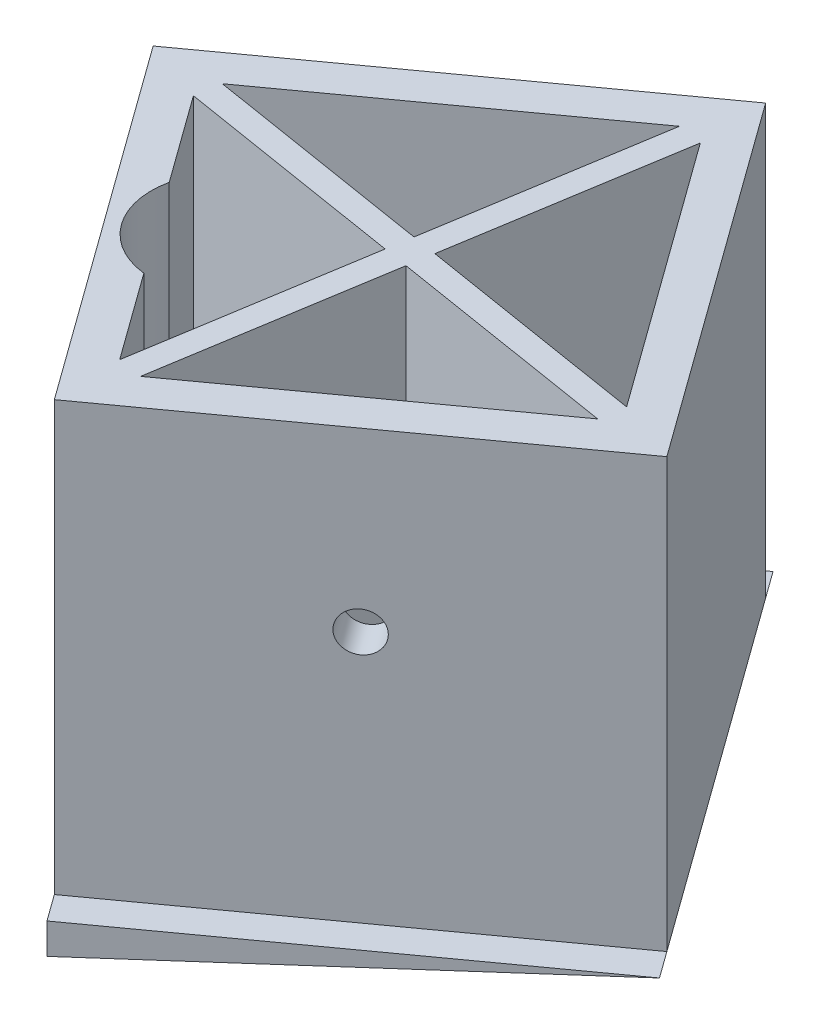
ISO-10303-21;
HEADER;
FILE_DESCRIPTION(('STEP AP214'),'2;1');
FILE_NAME('part.step','',(''),(''),'','','');
FILE_SCHEMA(('AUTOMOTIVE_DESIGN { 1 0 10303 214 1 1 1 1 }'));
ENDSEC;
DATA;
#1=APPLICATION_CONTEXT('core data for automotive mechanical design processes');
#2=APPLICATION_PROTOCOL_DEFINITION('international standard','automotive_design',2000,#1);
#3=PRODUCT_CONTEXT('',#1,'mechanical');
#4=PRODUCT('Part','Part','',(#3));
#5=PRODUCT_RELATED_PRODUCT_CATEGORY('part','',(#4));
#6=PRODUCT_DEFINITION_FORMATION('','',#4);
#7=PRODUCT_DEFINITION_CONTEXT('part definition',#1,'design');
#8=PRODUCT_DEFINITION('design','',#6,#7);
#9=PRODUCT_DEFINITION_SHAPE('','',#8);
#10=(LENGTH_UNIT() NAMED_UNIT(*) SI_UNIT(.MILLI.,.METRE.));
#11=(NAMED_UNIT(*) PLANE_ANGLE_UNIT() SI_UNIT($,.RADIAN.));
#12=(NAMED_UNIT(*) SI_UNIT($,.STERADIAN.) SOLID_ANGLE_UNIT());
#13=UNCERTAINTY_MEASURE_WITH_UNIT(LENGTH_MEASURE(1.E-05),#10,'distance_accuracy_value','');
#14=(GEOMETRIC_REPRESENTATION_CONTEXT(3) GLOBAL_UNCERTAINTY_ASSIGNED_CONTEXT((#13)) GLOBAL_UNIT_ASSIGNED_CONTEXT((#10,
#11,#12)) REPRESENTATION_CONTEXT('',''));
#15=CARTESIAN_POINT('',(0.,0.,0.));
#16=DIRECTION('',(0.,0.,1.));
#17=DIRECTION('',(1.,0.,0.));
#18=AXIS2_PLACEMENT_3D('',#15,#16,#17);
#19=CARTESIAN_POINT('',(0.,2.54,0.));
#20=DIRECTION('',(0.,1.,0.));
#21=DIRECTION('',(0.,0.,1.));
#22=AXIS2_PLACEMENT_3D('',#19,#20,#21);
#23=PLANE('',#22);
#24=DIRECTION('',(0.159232438824621,0.,-0.987241120712647));
#25=VECTOR('',#24,1.);
#26=CARTESIAN_POINT('',(-93.1889043607743,2.54,-15.0304684452862));
#27=LINE('',#26,#25);
#28=CARTESIAN_POINT('',(-108.848549962769,2.54,82.0593342870785));
#29=VERTEX_POINT('',#28);
#30=CARTESIAN_POINT('',(-108.421598003368,2.54,79.4122321387932));
#31=VERTEX_POINT('',#30);
#32=EDGE_CURVE('E474',#29,#31,#27,.T.);
#33=ORIENTED_EDGE('',*,*,#32,.F.);
#34=DIRECTION('',(0.810679228399881,0.,-0.585490553844359));
#35=VECTOR('',#34,1.);
#36=CARTESIAN_POINT('',(-100.626682754743,2.54,76.1213190812824));
#37=LINE('',#36,#35);
#38=CARTESIAN_POINT('',(-105.774495855082,2.54,79.839184098194));
#39=VERTEX_POINT('',#38);
#40=EDGE_CURVE('E596',#29,#39,#37,.T.);
#41=ORIENTED_EDGE('',*,*,#40,.T.);
#42=DIRECTION('',(-0.987241120712647,0.,-0.159232438824621));
#43=VECTOR('',#42,1.);
#44=CARTESIAN_POINT('',(-15.2326936425935,2.54,94.4427005840794));
#45=LINE('',#44,#43);
#46=EDGE_CURVE('E471',#39,#31,#45,.T.);
#47=ORIENTED_EDGE('',*,*,#46,.T.);
#48=EDGE_LOOP('',(#33,#41,#47));
#49=FACE_BOUND('',#48,.T.);
#50=ADVANCED_FACE('F34',(#49),#23,.T.);
#51=DIRECTION('',(0.159232438824621,0.,-0.987241120712647));
#52=VECTOR('',#51,1.);
#53=CARTESIAN_POINT('',(-93.1889043607743,2.54,-15.0304684452862));
#54=LINE('',#53,#52);
#55=CARTESIAN_POINT('',(-108.219372806061,2.54,78.1584359154881));
#56=VERTEX_POINT('',#55);
#57=CARTESIAN_POINT('',(-106.362472763232,2.54,66.6456556499519));
#58=VERTEX_POINT('',#57);
#59=EDGE_CURVE('E465',#56,#58,#54,.T.);
#60=ORIENTED_EDGE('',*,*,#59,.F.);
#61=DIRECTION('',(-0.987241120712647,0.,-0.159232438824621));
#62=VECTOR('',#61,1.);
#63=CARTESIAN_POINT('',(-15.0304684452863,2.54,93.1889043607744));
#64=LINE('',#63,#62);
#65=CARTESIAN_POINT('',(-96.7065925405243,2.54,80.0153359583165));
#66=VERTEX_POINT('',#65);
#67=EDGE_CURVE('E468',#66,#56,#64,.T.);
#68=ORIENTED_EDGE('',*,*,#67,.F.);
#69=DIRECTION('',(-0.585490553844359,0.,-0.81067922839988));
#70=VECTOR('',#69,1.);
#71=CARTESIAN_POINT('',(-96.1808070275254,2.54,80.7433466686227));
#72=LINE('',#71,#70);
#73=EDGE_CURVE('E386',#66,#58,#72,.T.);
#74=ORIENTED_EDGE('',*,*,#73,.T.);
#75=EDGE_LOOP('',(#60,#68,#74));
#76=FACE_BOUND('',#75,.T.);
#77=ADVANCED_FACE('F282',(#76),#23,.T.);
#78=DIRECTION('',(-0.987241120712647,0.,-0.159232438824621));
#79=VECTOR('',#78,1.);
#80=CARTESIAN_POINT('',(-15.2326936425935,2.54,94.4427005840794));
#81=LINE('',#80,#79);
#82=CARTESIAN_POINT('',(-109.675394226673,2.54,79.2100069414859));
#83=VERTEX_POINT('',#82);
#84=CARTESIAN_POINT('',(-121.188174492209,2.54,77.3531068986575));
#85=VERTEX_POINT('',#84);
#86=EDGE_CURVE('E312',#83,#85,#81,.T.);
#87=ORIENTED_EDGE('',*,*,#86,.T.);
#88=DIRECTION('',(0.585490553844354,0.,0.810679228399884));
#89=VECTOR('',#88,1.);
#90=CARTESIAN_POINT('',(-121.713960005208,2.54,76.6250961883513));
#91=LINE('',#90,#89);
#92=CARTESIAN_POINT('',(-118.022197337776,2.54,81.7367675740266));
#93=VERTEX_POINT('',#92);
#94=EDGE_CURVE('E384',#85,#93,#91,.T.);
#95=ORIENTED_EDGE('',*,*,#94,.T.);
#96=CARTESIAN_POINT('',(-114.3,2.54,82.55));
#97=DIRECTION('',(0.,1.,0.));
#98=DIRECTION('',(0.,0.,1.));
#99=AXIS2_PLACEMENT_3D('',#96,#97,#98);
#100=CIRCLE('',#99,3.81);
#101=CARTESIAN_POINT('',(-114.698271423935,2.54,86.3391265316531));
#102=VERTEX_POINT('',#101);
#103=EDGE_CURVE('E382',#93,#102,#100,.T.);
#104=ORIENTED_EDGE('',*,*,#103,.T.);
#105=DIRECTION('',(0.585490553844358,0.,0.810679228399882));
#106=VECTOR('',#105,1.);
#107=CARTESIAN_POINT('',(-114.698271423935,2.54,86.3391265316531));
#108=LINE('',#107,#106);
#109=CARTESIAN_POINT('',(-111.532294269501,2.54,90.7227872070222));
#110=VERTEX_POINT('',#109);
#111=EDGE_CURVE('E378',#102,#110,#108,.T.);
#112=ORIENTED_EDGE('',*,*,#111,.T.);
#113=DIRECTION('',(0.159232438824621,0.,-0.987241120712647));
#114=VECTOR('',#113,1.);
#115=CARTESIAN_POINT('',(-94.4427005840794,2.54,-15.2326936425935));
#116=LINE('',#115,#114);
#117=EDGE_CURVE('E476',#110,#83,#116,.T.);
#118=ORIENTED_EDGE('',*,*,#117,.T.);
#119=EDGE_LOOP('',(#87,#95,#104,#112,#118));
#120=FACE_BOUND('',#119,.T.);
#121=CARTESIAN_POINT('',(-114.3,2.54,82.55));
#122=DIRECTION('',(0.,1.,0.));
#123=DIRECTION('',(0.,0.,1.));
#124=AXIS2_PLACEMENT_3D('',#121,#122,#123);
#125=CIRCLE('',#124,1.5);
#126=CARTESIAN_POINT('',(-114.3,2.54,84.05));
#127=VERTEX_POINT('',#126);
#128=EDGE_CURVE('E315',#127,#127,#125,.T.);
#129=ORIENTED_EDGE('',*,*,#128,.F.);
#130=EDGE_LOOP('',(#129));
#131=FACE_BOUND('',#130,.T.);
#132=ADVANCED_FACE('F288',(#120,#131),#23,.T.);
#133=CARTESIAN_POINT('',(-96.1808070275254,21.59,80.7433466686227));
#134=DIRECTION('',(-0.81067922839988,0.,0.585490553844359));
#135=DIRECTION('',(0.585490553844359,0.,0.81067922839988));
#136=AXIS2_PLACEMENT_3D('',#133,#134,#135);
#137=PLANE('',#136);
#138=ORIENTED_EDGE('',*,*,#73,.F.);
#139=DIRECTION('',(0.,1.,0.));
#140=VECTOR('',#139,1.);
#141=CARTESIAN_POINT('',(-96.7065925405243,-33.5693312311857,80.0153359583166));
#142=LINE('',#141,#140);
#143=CARTESIAN_POINT('',(-96.7065925405243,21.59,80.0153359583166));
#144=VERTEX_POINT('',#143);
#145=EDGE_CURVE('E422',#66,#144,#142,.T.);
#146=ORIENTED_EDGE('',*,*,#145,.T.);
#147=DIRECTION('',(-0.585490553844359,0.,-0.81067922839988));
#148=VECTOR('',#147,1.);
#149=CARTESIAN_POINT('',(-96.1808070275254,21.59,80.7433466686227));
#150=LINE('',#149,#148);
#151=CARTESIAN_POINT('',(-106.362472763232,21.59,66.6456556499519));
#152=VERTEX_POINT('',#151);
#153=EDGE_CURVE('E381',#144,#152,#150,.T.);
#154=ORIENTED_EDGE('',*,*,#153,.T.);
#155=DIRECTION('',(0.,1.,0.));
#156=VECTOR('',#155,1.);
#157=CARTESIAN_POINT('',(-106.362472763232,-33.5693312311857,66.6456556499519));
#158=LINE('',#157,#156);
#159=EDGE_CURVE('E428',#58,#152,#158,.T.);
#160=ORIENTED_EDGE('',*,*,#159,.F.);
#161=EDGE_LOOP('',(#138,#146,#154,#160));
#162=FACE_BOUND('',#161,.T.);
#163=ADVANCED_FACE('F302',(#162),#137,.T.);
#164=CARTESIAN_POINT('',(-106.888258276231,21.59,65.9176449396458));
#165=DIRECTION('',(0.58549055384436,0.,0.81067922839988));
#166=DIRECTION('',(0.81067922839988,0.,-0.58549055384436));
#167=AXIS2_PLACEMENT_3D('',#164,#165,#166);
#168=PLANE('',#167);
#169=CARTESIAN_POINT('',(-114.301109140719,12.7,71.2713705639986));
#170=DIRECTION('',(0.58549055384436,0.,0.81067922839988));
#171=DIRECTION('',(0.81067922839988,0.,-0.58549055384436));
#172=AXIS2_PLACEMENT_3D('',#169,#170,#171);
#173=CIRCLE('',#172,1.);
#174=CARTESIAN_POINT('',(-113.49042991232,12.7,70.6858800101542));
#175=VERTEX_POINT('',#174);
#176=EDGE_CURVE('E460',#175,#175,#173,.T.);
#177=ORIENTED_EDGE('',*,*,#176,.F.);
#178=EDGE_LOOP('',(#177));
#179=FACE_BOUND('',#178,.T.);
#180=DIRECTION('',(0.,1.,0.));
#181=VECTOR('',#180,1.);
#182=CARTESIAN_POINT('',(-120.985949294902,-33.5693312311857,76.0993106753524));
#183=LINE('',#182,#181);
#184=CARTESIAN_POINT('',(-120.985949294902,8.88999999999999,76.0993106753524));
#185=VERTEX_POINT('',#184);
#186=CARTESIAN_POINT('',(-120.985949294902,21.59,76.0993106753524));
#187=VERTEX_POINT('',#186);
#188=EDGE_CURVE('E402',#185,#187,#183,.T.);
#189=ORIENTED_EDGE('',*,*,#188,.F.);
#190=DIRECTION('',(-0.81067922839988,0.,0.58549055384436));
#191=VECTOR('',#190,1.);
#192=CARTESIAN_POINT('',(-107.616268986537,8.89,66.4434304526447));
#193=LINE('',#192,#191);
#194=CARTESIAN_POINT('',(-107.616268986537,8.88999999999999,66.4434304526446));
#195=VERTEX_POINT('',#194);
#196=EDGE_CURVE('E585',#185,#195,#193,.F.);
#197=ORIENTED_EDGE('',*,*,#196,.T.);
#198=DIRECTION('',(0.,1.,0.));
#199=VECTOR('',#198,1.);
#200=CARTESIAN_POINT('',(-107.616268986537,-33.5693312311857,66.4434304526446));
#201=LINE('',#200,#199);
#202=CARTESIAN_POINT('',(-107.616268986537,21.59,66.4434304526447));
#203=VERTEX_POINT('',#202);
#204=EDGE_CURVE('E431',#195,#203,#201,.T.);
#205=ORIENTED_EDGE('',*,*,#204,.T.);
#206=DIRECTION('',(-0.81067922839988,0.,0.58549055384436));
#207=VECTOR('',#206,1.);
#208=CARTESIAN_POINT('',(-106.888258276231,21.59,65.9176449396458));
#209=LINE('',#208,#207);
#210=EDGE_CURVE('E398',#203,#187,#209,.T.);
#211=ORIENTED_EDGE('',*,*,#210,.T.);
#212=EDGE_LOOP('',(#189,#197,#205,#211));
#213=FACE_BOUND('',#212,.T.);
#214=ADVANCED_FACE('F307',(#179,#213),#168,.T.);
#215=CARTESIAN_POINT('',(-111.006508756502,21.59,91.4507979173283));
#216=DIRECTION('',(-0.585490553844359,0.,-0.810679228399881));
#217=DIRECTION('',(-0.810679228399881,0.,0.585490553844359));
#218=AXIS2_PLACEMENT_3D('',#215,#216,#217);
#219=PLANE('',#218);
#220=CARTESIAN_POINT('',(-103.593657892014,12.7,86.0970722929755));
#221=DIRECTION('',(-0.585490553844359,0.,-0.810679228399881));
#222=DIRECTION('',(-0.810679228399881,0.,0.585490553844359));
#223=AXIS2_PLACEMENT_3D('',#220,#221,#222);
#224=CIRCLE('',#223,1.);
#225=CARTESIAN_POINT('',(-104.404337120414,12.7,86.6825628468199));
#226=VERTEX_POINT('',#225);
#227=EDGE_CURVE('E481',#226,#226,#224,.T.);
#228=ORIENTED_EDGE('',*,*,#227,.F.);
#229=EDGE_LOOP('',(#228));
#230=FACE_BOUND('',#229,.T.);
#231=DIRECTION('',(0.,1.,0.));
#232=VECTOR('',#231,1.);
#233=CARTESIAN_POINT('',(-96.9088177378316,-33.5693312311857,81.2691321816216));
#234=LINE('',#233,#232);
#235=CARTESIAN_POINT('',(-96.9088177378316,8.88999999999999,81.2691321816216));
#236=VERTEX_POINT('',#235);
#237=CARTESIAN_POINT('',(-96.9088177378316,21.59,81.2691321816216));
#238=VERTEX_POINT('',#237);
#239=EDGE_CURVE('E420',#236,#238,#234,.T.);
#240=ORIENTED_EDGE('',*,*,#239,.F.);
#241=DIRECTION('',(0.810679228399881,0.,-0.585490553844359));
#242=VECTOR('',#241,1.);
#243=CARTESIAN_POINT('',(-110.278498046196,8.89,90.9250124043294));
#244=LINE('',#243,#242);
#245=CARTESIAN_POINT('',(-110.278498046196,8.88999999999999,90.9250124043294));
#246=VERTEX_POINT('',#245);
#247=EDGE_CURVE('E43',#236,#246,#244,.F.);
#248=ORIENTED_EDGE('',*,*,#247,.T.);
#249=DIRECTION('',(0.,1.,0.));
#250=VECTOR('',#249,1.);
#251=CARTESIAN_POINT('',(-110.278498046196,-33.5693312311857,90.9250124043294));
#252=LINE('',#251,#250);
#253=CARTESIAN_POINT('',(-110.278498046196,21.59,90.9250124043294));
#254=VERTEX_POINT('',#253);
#255=EDGE_CURVE('E414',#246,#254,#252,.T.);
#256=ORIENTED_EDGE('',*,*,#255,.T.);
#257=DIRECTION('',(0.810679228399881,0.,-0.585490553844359));
#258=VECTOR('',#257,1.);
#259=CARTESIAN_POINT('',(-111.006508756502,21.59,91.4507979173283));
#260=LINE('',#259,#258);
#261=EDGE_CURVE('E377',#254,#238,#260,.T.);
#262=ORIENTED_EDGE('',*,*,#261,.T.);
#263=EDGE_LOOP('',(#240,#248,#256,#262));
#264=FACE_BOUND('',#263,.T.);
#265=ADVANCED_FACE('F562',(#230,#264),#219,.T.);
#266=CARTESIAN_POINT('',(-99.9901887217764,2.54,72.2151362990608));
#267=DIRECTION('',(-0.810679228399881,0.,0.585490553844359));
#268=DIRECTION('',(0.585490553844359,0.,0.81067922839988));
#269=AXIS2_PLACEMENT_3D('',#266,#267,#268);
#270=PLANE('',#269);
#271=DIRECTION('',(-0.585490553844359,0.,-0.810679228399881));
#272=VECTOR('',#271,1.);
#273=CARTESIAN_POINT('',(-99.9901887217764,0.,72.2151362990608));
#274=LINE('',#273,#272);
#275=CARTESIAN_POINT('',(-93.5211035923501,0.,81.172331093651));
#276=VERTEX_POINT('',#275);
#277=CARTESIAN_POINT('',(-106.459273851203,0.,63.2579415044705));
#278=VERTEX_POINT('',#277);
#279=EDGE_CURVE('E336',#276,#278,#274,.T.);
#280=ORIENTED_EDGE('',*,*,#279,.T.);
#281=DIRECTION('',(0.,-1.,0.));
#282=VECTOR('',#281,1.);
#283=CARTESIAN_POINT('',(-106.459273851203,2.54,63.2579415044705));
#284=LINE('',#283,#282);
#285=CARTESIAN_POINT('',(-106.459273851203,21.59,63.2579415044705));
#286=VERTEX_POINT('',#285);
#287=EDGE_CURVE('E340',#286,#278,#284,.T.);
#288=ORIENTED_EDGE('',*,*,#287,.F.);
#289=DIRECTION('',(-0.58549055384436,0.,-0.81067922839988));
#290=VECTOR('',#289,1.);
#291=CARTESIAN_POINT('',(-93.5211035923501,21.59,81.172331093651));
#292=LINE('',#291,#290);
#293=CARTESIAN_POINT('',(-93.5211035923501,21.59,81.172331093651));
#294=VERTEX_POINT('',#293);
#295=EDGE_CURVE('E367',#294,#286,#292,.T.);
#296=ORIENTED_EDGE('',*,*,#295,.F.);
#297=DIRECTION('',(0.,-1.,0.));
#298=VECTOR('',#297,1.);
#299=CARTESIAN_POINT('',(-93.5211035923501,2.54,81.172331093651));
#300=LINE('',#299,#298);
#301=EDGE_CURVE('E316',#294,#276,#300,.T.);
#302=ORIENTED_EDGE('',*,*,#301,.T.);
#303=EDGE_LOOP('',(#280,#288,#296,#302));
#304=FACE_BOUND('',#303,.T.);
#305=ADVANCED_FACE('F565',(#304),#270,.F.);
#306=CARTESIAN_POINT('',(-6.46908512942643,2.54,-8.95719479459041));
#307=DIRECTION('',(0.58549055384436,0.,0.81067922839988));
#308=DIRECTION('',(0.81067922839988,0.,-0.58549055384436));
#309=AXIS2_PLACEMENT_3D('',#306,#307,#308);
#310=PLANE('',#309);
#311=CARTESIAN_POINT('',(-115.416468645793,12.7,69.7270266338968));
#312=DIRECTION('',(0.58549055384436,0.,0.81067922839988));
#313=DIRECTION('',(0.81067922839988,0.,-0.58549055384436));
#314=AXIS2_PLACEMENT_3D('',#311,#312,#313);
#315=CIRCLE('',#314,1.);
#316=CARTESIAN_POINT('',(-114.605789417393,12.7,69.1415360800524));
#317=VERTEX_POINT('',#316);
#318=EDGE_CURVE('E484',#317,#317,#315,.T.);
#319=ORIENTED_EDGE('',*,*,#318,.T.);
#320=EDGE_LOOP('',(#319));
#321=FACE_BOUND('',#320,.T.);
#322=DIRECTION('',(-0.81067922839988,0.,0.58549055384436));
#323=VECTOR('',#322,1.);
#324=CARTESIAN_POINT('',(-6.46908512942643,0.,-8.95719479459041));
#325=LINE('',#324,#323);
#326=CARTESIAN_POINT('',(-124.373663440383,0.,76.1961117633231));
#327=VERTEX_POINT('',#326);
#328=EDGE_CURVE('E323',#278,#327,#325,.T.);
#329=ORIENTED_EDGE('',*,*,#328,.T.);
#330=DIRECTION('',(0.,-1.,0.));
#331=VECTOR('',#330,1.);
#332=CARTESIAN_POINT('',(-124.373663440383,2.54,76.1961117633231));
#333=LINE('',#332,#331);
#334=CARTESIAN_POINT('',(-124.373663440383,21.59,76.1961117633231));
#335=VERTEX_POINT('',#334);
#336=EDGE_CURVE('E338',#335,#327,#333,.T.);
#337=ORIENTED_EDGE('',*,*,#336,.F.);
#338=DIRECTION('',(-0.81067922839988,0.,0.58549055384436));
#339=VECTOR('',#338,1.);
#340=CARTESIAN_POINT('',(-106.459273851203,21.59,63.2579415044705));
#341=LINE('',#340,#339);
#342=EDGE_CURVE('E366',#286,#335,#341,.T.);
#343=ORIENTED_EDGE('',*,*,#342,.F.);
#344=ORIENTED_EDGE('',*,*,#287,.T.);
#345=EDGE_LOOP('',(#329,#337,#343,#344));
#346=FACE_BOUND('',#345,.T.);
#347=ADVANCED_FACE('F277',(#321,#346),#310,.F.);
#348=CARTESIAN_POINT('',(-117.904578310957,2.54,85.1533065579128));
#349=DIRECTION('',(0.810679228399884,0.,-0.585490553844355));
#350=DIRECTION('',(-0.585490553844355,0.,-0.810679228399884));
#351=AXIS2_PLACEMENT_3D('',#348,#349,#350);
#352=PLANE('',#351);
#353=ORIENTED_EDGE('',*,*,#336,.T.);
#354=DIRECTION('',(0.585490553844359,0.,0.810679228399881));
#355=VECTOR('',#354,1.);
#356=CARTESIAN_POINT('',(-125.34030834478,0.,74.8576803572349));
#357=LINE('',#356,#355);
#358=CARTESIAN_POINT('',(-125.34030834478,0.,74.8576803572349));
#359=VERTEX_POINT('',#358);
#360=EDGE_CURVE('E221',#359,#327,#357,.T.);
#361=ORIENTED_EDGE('',*,*,#360,.F.);
#362=DIRECTION('',(0.,1.,0.));
#363=VECTOR('',#362,1.);
#364=CARTESIAN_POINT('',(-125.34030834478,0.,74.8576803572349));
#365=LINE('',#364,#363);
#366=CARTESIAN_POINT('',(-125.34030834478,-1.54524269032752,74.8576803572349));
#367=VERTEX_POINT('',#366);
#368=EDGE_CURVE('E213',#367,#359,#365,.T.);
#369=ORIENTED_EDGE('',*,*,#368,.F.);
#370=DIRECTION('',(0.585490553844359,0.,0.810679228399881));
#371=VECTOR('',#370,1.);
#372=CARTESIAN_POINT('',(-125.34030834478,-1.54524269032752,74.8576803572349));
#373=LINE('',#372,#371);
#374=CARTESIAN_POINT('',(-110.468848277133,-1.54524269032752,95.4489327585918));
#375=VERTEX_POINT('',#374);
#376=EDGE_CURVE('E219',#367,#375,#373,.T.);
#377=ORIENTED_EDGE('',*,*,#376,.T.);
#378=DIRECTION('',(0.,1.,0.));
#379=VECTOR('',#378,1.);
#380=CARTESIAN_POINT('',(-110.468848277133,0.,95.4489327585918));
#381=LINE('',#380,#379);
#382=CARTESIAN_POINT('',(-110.468848277133,0.,95.4489327585918));
#383=VERTEX_POINT('',#382);
#384=EDGE_CURVE('E256',#375,#383,#381,.T.);
#385=ORIENTED_EDGE('',*,*,#384,.T.);
#386=CARTESIAN_POINT('',(-111.435493181531,0.,94.1105013525035));
#387=VERTEX_POINT('',#386);
#388=EDGE_CURVE('E242',#387,#383,#357,.T.);
#389=ORIENTED_EDGE('',*,*,#388,.F.);
#390=DIRECTION('',(0.,-1.,0.));
#391=VECTOR('',#390,1.);
#392=CARTESIAN_POINT('',(-111.435493181531,2.54,94.1105013525036));
#393=LINE('',#392,#391);
#394=CARTESIAN_POINT('',(-111.435493181531,21.59,94.1105013525036));
#395=VERTEX_POINT('',#394);
#396=EDGE_CURVE('E320',#395,#387,#393,.T.);
#397=ORIENTED_EDGE('',*,*,#396,.F.);
#398=DIRECTION('',(0.585490553844355,0.,0.810679228399884));
#399=VECTOR('',#398,1.);
#400=CARTESIAN_POINT('',(-124.373663440383,21.59,76.1961117633231));
#401=LINE('',#400,#399);
#402=EDGE_CURVE('E360',#335,#395,#401,.T.);
#403=ORIENTED_EDGE('',*,*,#402,.F.);
#404=EDGE_LOOP('',(#353,#361,#369,#377,#385,#389,#397,#403));
#405=FACE_BOUND('',#404,.T.);
#406=ADVANCED_FACE('F216',(#405),#352,.F.);
#407=CARTESIAN_POINT('',(-114.3,2.54,82.55));
#408=DIRECTION('',(0.,-1.,0.));
#409=DIRECTION('',(0.,0.,-1.));
#410=AXIS2_PLACEMENT_3D('',#407,#408,#409);
#411=CYLINDRICAL_SURFACE('',#410,1.5);
#412=ORIENTED_EDGE('',*,*,#128,.T.);
#413=EDGE_LOOP('',(#412));
#414=FACE_BOUND('',#413,.T.);
#415=CARTESIAN_POINT('',(-114.3,-1.23432234001409,82.55));
#416=DIRECTION('',(-0.0565501243107783,0.997564050259825,0.0408417564466732));
#417=DIRECTION('',(0.808704454544095,0.0697564737441182,-0.584064328281847));
#418=AXIS2_PLACEMENT_3D('',#415,#416,#417);
#419=ELLIPSE('',#418,1.50366284712175,1.5);
#420=CARTESIAN_POINT('',(-113.0839811574,-1.12943212209884,81.6717641692335));
#421=VERTEX_POINT('',#420);
#422=EDGE_CURVE('E259',#421,#421,#419,.T.);
#423=ORIENTED_EDGE('',*,*,#422,.F.);
#424=EDGE_LOOP('',(#423));
#425=FACE_BOUND('',#424,.T.);
#426=ADVANCED_FACE('F265',(#414,#425),#411,.F.);
#427=CARTESIAN_POINT('',(6.46908512942629,2.54,8.95719479459025));
#428=DIRECTION('',(-0.585490553844358,0.,-0.810679228399881));
#429=DIRECTION('',(-0.810679228399881,0.,0.585490553844358));
#430=AXIS2_PLACEMENT_3D('',#427,#428,#429);
#431=PLANE('',#430);
#432=CARTESIAN_POINT('',(-102.47829838694,12.7,87.6414162230773));
#433=DIRECTION('',(0.585490553844359,0.,0.810679228399881));
#434=DIRECTION('',(0.810679228399881,0.,-0.585490553844359));
#435=AXIS2_PLACEMENT_3D('',#432,#433,#434);
#436=CIRCLE('',#435,1.);
#437=CARTESIAN_POINT('',(-101.66761915854,12.7,87.055925669233));
#438=VERTEX_POINT('',#437);
#439=EDGE_CURVE('E237',#438,#438,#436,.T.);
#440=ORIENTED_EDGE('',*,*,#439,.F.);
#441=EDGE_LOOP('',(#440));
#442=FACE_BOUND('',#441,.T.);
#443=DIRECTION('',(0.810679228399881,0.,-0.585490553844359));
#444=VECTOR('',#443,1.);
#445=CARTESIAN_POINT('',(6.46908512942629,0.,8.95719479459025));
#446=LINE('',#445,#444);
#447=EDGE_CURVE('E317',#387,#276,#446,.T.);
#448=ORIENTED_EDGE('',*,*,#447,.T.);
#449=ORIENTED_EDGE('',*,*,#301,.F.);
#450=DIRECTION('',(0.810679228399881,0.,-0.585490553844359));
#451=VECTOR('',#450,1.);
#452=CARTESIAN_POINT('',(-111.435493181531,21.59,94.1105013525036));
#453=LINE('',#452,#451);
#454=EDGE_CURVE('E327',#395,#294,#453,.T.);
#455=ORIENTED_EDGE('',*,*,#454,.F.);
#456=ORIENTED_EDGE('',*,*,#396,.T.);
#457=EDGE_LOOP('',(#448,#449,#455,#456));
#458=FACE_BOUND('',#457,.T.);
#459=ADVANCED_FACE('F267',(#442,#458),#431,.F.);
#460=DIRECTION('',(0.159232438824621,0.,-0.987241120712647));
#461=VECTOR('',#460,1.);
#462=CARTESIAN_POINT('',(-94.4427005840794,2.54,-15.2326936425935));
#463=LINE('',#462,#461);
#464=CARTESIAN_POINT('',(-109.473169029366,2.54,77.9562107181809));
#465=VERTEX_POINT('',#464);
#466=CARTESIAN_POINT('',(-109.046217069965,2.54,75.3091085698956));
#467=VERTEX_POINT('',#466);
#468=EDGE_CURVE('E463',#465,#467,#463,.T.);
#469=ORIENTED_EDGE('',*,*,#468,.T.);
#470=DIRECTION('',(-0.81067922839988,0.,0.58549055384436));
#471=VECTOR('',#470,1.);
#472=CARTESIAN_POINT('',(-117.26808427799,2.54,81.2471237756917));
#473=LINE('',#472,#471);
#474=CARTESIAN_POINT('',(-112.120271177651,2.54,77.52925875878));
#475=VERTEX_POINT('',#474);
#476=EDGE_CURVE('E598',#467,#475,#473,.T.);
#477=ORIENTED_EDGE('',*,*,#476,.T.);
#478=DIRECTION('',(-0.987241120712647,0.,-0.159232438824621));
#479=VECTOR('',#478,1.);
#480=CARTESIAN_POINT('',(-15.0304684452863,2.54,93.1889043607744));
#481=LINE('',#480,#479);
#482=EDGE_CURVE('E389',#465,#475,#481,.T.);
#483=ORIENTED_EDGE('',*,*,#482,.F.);
#484=EDGE_LOOP('',(#469,#477,#483));
#485=FACE_BOUND('',#484,.T.);
#486=ADVANCED_FACE('F274',(#485),#23,.T.);
#487=CARTESIAN_POINT('',(0.,21.59,0.));
#488=DIRECTION('',(0.,1.,0.));
#489=DIRECTION('',(0.,0.,1.));
#490=AXIS2_PLACEMENT_3D('',#487,#488,#489);
#491=PLANE('',#490);
#492=ORIENTED_EDGE('',*,*,#153,.F.);
#493=DIRECTION('',(0.987241120712647,0.,0.159232438824621));
#494=VECTOR('',#493,1.);
#495=CARTESIAN_POINT('',(-15.0304684452863,21.59,93.1889043607744));
#496=LINE('',#495,#494);
#497=CARTESIAN_POINT('',(-108.219372806061,21.59,78.1584359154881));
#498=VERTEX_POINT('',#497);
#499=EDGE_CURVE('E442',#498,#144,#496,.T.);
#500=ORIENTED_EDGE('',*,*,#499,.F.);
#501=DIRECTION('',(-0.159232438824621,0.,0.987241120712647));
#502=VECTOR('',#501,1.);
#503=CARTESIAN_POINT('',(-93.1889043607743,21.59,-15.0304684452862));
#504=LINE('',#503,#502);
#505=EDGE_CURVE('E439',#152,#498,#504,.T.);
#506=ORIENTED_EDGE('',*,*,#505,.F.);
#507=EDGE_LOOP('',(#492,#500,#506));
#508=FACE_BOUND('',#507,.T.);
#509=ORIENTED_EDGE('',*,*,#210,.F.);
#510=DIRECTION('',(-0.159232438824621,0.,0.987241120712647));
#511=VECTOR('',#510,1.);
#512=CARTESIAN_POINT('',(-94.4427005840794,21.59,-15.2326936425935));
#513=LINE('',#512,#511);
#514=CARTESIAN_POINT('',(-109.473169029366,21.59,77.9562107181809));
#515=VERTEX_POINT('',#514);
#516=EDGE_CURVE('E405',#203,#515,#513,.T.);
#517=ORIENTED_EDGE('',*,*,#516,.T.);
#518=DIRECTION('',(0.987241120712647,0.,0.159232438824621));
#519=VECTOR('',#518,1.);
#520=CARTESIAN_POINT('',(-15.0304684452863,21.59,93.1889043607744));
#521=LINE('',#520,#519);
#522=EDGE_CURVE('E457',#187,#515,#521,.T.);
#523=ORIENTED_EDGE('',*,*,#522,.F.);
#524=EDGE_LOOP('',(#509,#517,#523));
#525=FACE_BOUND('',#524,.T.);
#526=DIRECTION('',(0.585490553844354,0.,0.810679228399884));
#527=VECTOR('',#526,1.);
#528=CARTESIAN_POINT('',(-121.713960005208,21.59,76.6250961883513));
#529=LINE('',#528,#527);
#530=CARTESIAN_POINT('',(-121.188174492209,21.59,77.3531068986575));
#531=VERTEX_POINT('',#530);
#532=CARTESIAN_POINT('',(-118.022197337776,21.59,81.7367675740266));
#533=VERTEX_POINT('',#532);
#534=EDGE_CURVE('E396',#531,#533,#529,.T.);
#535=ORIENTED_EDGE('',*,*,#534,.F.);
#536=DIRECTION('',(0.987241120712647,0.,0.159232438824621));
#537=VECTOR('',#536,1.);
#538=CARTESIAN_POINT('',(-15.2326936425935,21.59,94.4427005840794));
#539=LINE('',#538,#537);
#540=CARTESIAN_POINT('',(-109.675394226673,21.59,79.2100069414859));
#541=VERTEX_POINT('',#540);
#542=EDGE_CURVE('E454',#531,#541,#539,.T.);
#543=ORIENTED_EDGE('',*,*,#542,.T.);
#544=DIRECTION('',(-0.159232438824621,0.,0.987241120712647));
#545=VECTOR('',#544,1.);
#546=CARTESIAN_POINT('',(-94.4427005840794,21.59,-15.2326936425935));
#547=LINE('',#546,#545);
#548=CARTESIAN_POINT('',(-111.532294269501,21.59,90.7227872070222));
#549=VERTEX_POINT('',#548);
#550=EDGE_CURVE('E451',#541,#549,#547,.T.);
#551=ORIENTED_EDGE('',*,*,#550,.T.);
#552=DIRECTION('',(0.585490553844358,0.,0.810679228399882));
#553=VECTOR('',#552,1.);
#554=CARTESIAN_POINT('',(-114.698271423935,21.59,86.3391265316531));
#555=LINE('',#554,#553);
#556=CARTESIAN_POINT('',(-114.698271423935,21.59,86.3391265316531));
#557=VERTEX_POINT('',#556);
#558=EDGE_CURVE('E392',#557,#549,#555,.T.);
#559=ORIENTED_EDGE('',*,*,#558,.F.);
#560=CARTESIAN_POINT('',(-114.3,21.59,82.55));
#561=DIRECTION('',(0.,1.,0.));
#562=DIRECTION('',(0.,0.,1.));
#563=AXIS2_PLACEMENT_3D('',#560,#561,#562);
#564=CIRCLE('',#563,3.81);
#565=EDGE_CURVE('E394',#533,#557,#564,.T.);
#566=ORIENTED_EDGE('',*,*,#565,.F.);
#567=EDGE_LOOP('',(#535,#543,#551,#559,#566));
#568=FACE_BOUND('',#567,.T.);
#569=ORIENTED_EDGE('',*,*,#261,.F.);
#570=DIRECTION('',(-0.159232438824621,0.,0.987241120712647));
#571=VECTOR('',#570,1.);
#572=CARTESIAN_POINT('',(-93.1889043607743,21.59,-15.0304684452862));
#573=LINE('',#572,#571);
#574=CARTESIAN_POINT('',(-108.421598003368,21.59,79.4122321387932));
#575=VERTEX_POINT('',#574);
#576=EDGE_CURVE('E448',#575,#254,#573,.T.);
#577=ORIENTED_EDGE('',*,*,#576,.F.);
#578=DIRECTION('',(0.987241120712647,0.,0.159232438824621));
#579=VECTOR('',#578,1.);
#580=CARTESIAN_POINT('',(-15.2326936425935,21.59,94.4427005840794));
#581=LINE('',#580,#579);
#582=EDGE_CURVE('E445',#575,#238,#581,.T.);
#583=ORIENTED_EDGE('',*,*,#582,.T.);
#584=EDGE_LOOP('',(#569,#577,#583));
#585=FACE_BOUND('',#584,.T.);
#586=ORIENTED_EDGE('',*,*,#295,.T.);
#587=ORIENTED_EDGE('',*,*,#342,.T.);
#588=ORIENTED_EDGE('',*,*,#402,.T.);
#589=ORIENTED_EDGE('',*,*,#454,.T.);
#590=EDGE_LOOP('',(#586,#587,#588,#589));
#591=FACE_BOUND('',#590,.T.);
#592=ADVANCED_FACE('F293',(#508,#525,#568,#585,#591),#491,.T.);
#593=CARTESIAN_POINT('',(-121.713960005208,21.59,76.6250961883513));
#594=DIRECTION('',(0.810679228399884,0.,-0.585490553844354));
#595=DIRECTION('',(-0.585490553844354,0.,-0.810679228399884));
#596=AXIS2_PLACEMENT_3D('',#593,#594,#595);
#597=PLANE('',#596);
#598=DIRECTION('',(0.,1.,0.));
#599=VECTOR('',#598,1.);
#600=CARTESIAN_POINT('',(-121.188174492209,-33.5693312311857,77.3531068986575));
#601=LINE('',#600,#599);
#602=EDGE_CURVE('E404',#85,#531,#601,.T.);
#603=ORIENTED_EDGE('',*,*,#602,.T.);
#604=ORIENTED_EDGE('',*,*,#534,.T.);
#605=DIRECTION('',(0.,-1.,0.));
#606=VECTOR('',#605,1.);
#607=CARTESIAN_POINT('',(-118.022197337776,21.59,81.7367675740266));
#608=LINE('',#607,#606);
#609=EDGE_CURVE('E371',#533,#93,#608,.T.);
#610=ORIENTED_EDGE('',*,*,#609,.T.);
#611=ORIENTED_EDGE('',*,*,#94,.F.);
#612=EDGE_LOOP('',(#603,#604,#610,#611));
#613=FACE_BOUND('',#612,.T.);
#614=ADVANCED_FACE('F298',(#613),#597,.T.);
#615=CARTESIAN_POINT('',(-114.3,21.59,82.55));
#616=DIRECTION('',(0.,-1.,0.));
#617=DIRECTION('',(0.,0.,-1.));
#618=AXIS2_PLACEMENT_3D('',#615,#616,#617);
#619=CYLINDRICAL_SURFACE('',#618,3.81);
#620=ORIENTED_EDGE('',*,*,#103,.F.);
#621=ORIENTED_EDGE('',*,*,#609,.F.);
#622=ORIENTED_EDGE('',*,*,#565,.T.);
#623=DIRECTION('',(0.,-1.,0.));
#624=VECTOR('',#623,1.);
#625=CARTESIAN_POINT('',(-114.698271423935,21.59,86.3391265316531));
#626=LINE('',#625,#624);
#627=EDGE_CURVE('E374',#557,#102,#626,.T.);
#628=ORIENTED_EDGE('',*,*,#627,.T.);
#629=EDGE_LOOP('',(#620,#621,#622,#628));
#630=FACE_BOUND('',#629,.T.);
#631=ADVANCED_FACE('F569',(#630),#619,.F.);
#632=CARTESIAN_POINT('',(-114.698271423935,21.59,86.3391265316531));
#633=DIRECTION('',(0.810679228399882,0.,-0.585490553844358));
#634=DIRECTION('',(-0.585490553844358,0.,-0.810679228399882));
#635=AXIS2_PLACEMENT_3D('',#632,#633,#634);
#636=PLANE('',#635);
#637=DIRECTION('',(0.,1.,0.));
#638=VECTOR('',#637,1.);
#639=CARTESIAN_POINT('',(-111.532294269501,-33.5693312311857,90.7227872070222));
#640=LINE('',#639,#638);
#641=EDGE_CURVE('E411',#110,#549,#640,.T.);
#642=ORIENTED_EDGE('',*,*,#641,.F.);
#643=ORIENTED_EDGE('',*,*,#111,.F.);
#644=ORIENTED_EDGE('',*,*,#627,.F.);
#645=ORIENTED_EDGE('',*,*,#558,.T.);
#646=EDGE_LOOP('',(#642,#643,#644,#645));
#647=FACE_BOUND('',#646,.T.);
#648=ADVANCED_FACE('F557',(#647),#636,.T.);
#649=CARTESIAN_POINT('',(-15.2326936425935,-33.5693312311857,94.4427005840794));
#650=DIRECTION('',(-0.159232438824621,0.,0.987241120712647));
#651=DIRECTION('',(0.987241120712647,0.,0.159232438824621));
#652=AXIS2_PLACEMENT_3D('',#649,#650,#651);
#653=PLANE('',#652);
#654=CARTESIAN_POINT('',(-108.421598003368,12.7,79.4122321387932));
#655=DIRECTION('',(-0.159232438824621,0.,0.987241120712647));
#656=DIRECTION('',(0.987241120712647,0.,0.159232438824621));
#657=AXIS2_PLACEMENT_3D('',#654,#655,#656);
#658=ELLIPSE('',#657,1.4142135623731,1.);
#659=CARTESIAN_POINT('',(-109.675394226673,13.1399431781491,79.2100069414859));
#660=VERTEX_POINT('',#659);
#661=CARTESIAN_POINT('',(-109.675394226673,12.2600568218508,79.2100069414859));
#662=VERTEX_POINT('',#661);
#663=EDGE_CURVE('E487',#660,#662,#658,.T.);
#664=ORIENTED_EDGE('',*,*,#663,.F.);
#665=DIRECTION('',(0.,1.,0.));
#666=VECTOR('',#665,1.);
#667=CARTESIAN_POINT('',(-109.675394226673,-33.5693312311857,79.2100069414859));
#668=LINE('',#667,#666);
#669=EDGE_CURVE('E407',#660,#541,#668,.T.);
#670=ORIENTED_EDGE('',*,*,#669,.T.);
#671=ORIENTED_EDGE('',*,*,#542,.F.);
#672=ORIENTED_EDGE('',*,*,#602,.F.);
#673=ORIENTED_EDGE('',*,*,#86,.F.);
#674=EDGE_CURVE('E408',#83,#662,#668,.T.);
#675=ORIENTED_EDGE('',*,*,#674,.T.);
#676=EDGE_LOOP('',(#664,#670,#671,#672,#673,#675));
#677=FACE_BOUND('',#676,.T.);
#678=ADVANCED_FACE('F553',(#677),#653,.T.);
#679=CARTESIAN_POINT('',(-94.4427005840794,-33.5693312311857,-15.2326936425935));
#680=DIRECTION('',(-0.987241120712647,0.,-0.159232438824621));
#681=DIRECTION('',(-0.159232438824621,0.,0.987241120712647));
#682=AXIS2_PLACEMENT_3D('',#679,#680,#681);
#683=PLANE('',#682);
#684=CARTESIAN_POINT('',(-109.473169029366,12.7,77.9562107181808));
#685=DIRECTION('',(-0.987241120712647,0.,-0.159232438824621));
#686=DIRECTION('',(-0.159232438824621,0.,0.987241120712647));
#687=AXIS2_PLACEMENT_3D('',#684,#685,#686);
#688=ELLIPSE('',#687,1.4142135623731,1.);
#689=EDGE_CURVE('E489',#662,#660,#688,.T.);
#690=ORIENTED_EDGE('',*,*,#689,.F.);
#691=ORIENTED_EDGE('',*,*,#674,.F.);
#692=ORIENTED_EDGE('',*,*,#117,.F.);
#693=ORIENTED_EDGE('',*,*,#641,.T.);
#694=ORIENTED_EDGE('',*,*,#550,.F.);
#695=ORIENTED_EDGE('',*,*,#669,.F.);
#696=EDGE_LOOP('',(#690,#691,#692,#693,#694,#695));
#697=FACE_BOUND('',#696,.T.);
#698=ADVANCED_FACE('F549',(#697),#683,.T.);
#699=CARTESIAN_POINT('',(-93.1889043607743,-33.5693312311857,-15.0304684452862));
#700=DIRECTION('',(-0.987241120712647,0.,-0.159232438824621));
#701=DIRECTION('',(-0.159232438824621,0.,0.987241120712647));
#702=AXIS2_PLACEMENT_3D('',#699,#700,#701);
#703=PLANE('',#702);
#704=ORIENTED_EDGE('',*,*,#255,.F.);
#705=CARTESIAN_POINT('',(-108.848549962769,8.89,82.0593342870785));
#706=DIRECTION('',(-0.987241120712647,0.,-0.159232438824621));
#707=DIRECTION('',(-0.159232438824621,0.,0.987241120712647));
#708=AXIS2_PLACEMENT_3D('',#705,#706,#707);
#709=ELLIPSE('',#708,8.98025612106916,6.35);
#710=EDGE_CURVE('E11',#246,#29,#709,.F.);
#711=ORIENTED_EDGE('',*,*,#710,.T.);
#712=ORIENTED_EDGE('',*,*,#32,.T.);
#713=DIRECTION('',(0.,1.,0.));
#714=VECTOR('',#713,1.);
#715=CARTESIAN_POINT('',(-108.421598003368,-33.5693312311857,79.4122321387932));
#716=LINE('',#715,#714);
#717=CARTESIAN_POINT('',(-108.421598003368,11.7,79.4122321387932));
#718=VERTEX_POINT('',#717);
#719=EDGE_CURVE('E417',#31,#718,#716,.T.);
#720=ORIENTED_EDGE('',*,*,#719,.T.);
#721=CARTESIAN_POINT('',(-108.421598003368,12.7,79.4122321387932));
#722=DIRECTION('',(-0.987241120712647,0.,-0.159232438824621));
#723=DIRECTION('',(-0.159232438824621,0.,0.987241120712647));
#724=AXIS2_PLACEMENT_3D('',#721,#722,#723);
#725=ELLIPSE('',#724,1.4142135623731,1.);
#726=CARTESIAN_POINT('',(-108.421598003368,13.7,79.4122321387932));
#727=VERTEX_POINT('',#726);
#728=EDGE_CURVE('E491',#718,#727,#725,.T.);
#729=ORIENTED_EDGE('',*,*,#728,.T.);
#730=EDGE_CURVE('E416',#727,#575,#716,.T.);
#731=ORIENTED_EDGE('',*,*,#730,.T.);
#732=ORIENTED_EDGE('',*,*,#576,.T.);
#733=EDGE_LOOP('',(#704,#711,#712,#720,#729,#731,#732));
#734=FACE_BOUND('',#733,.T.);
#735=ADVANCED_FACE('F546',(#734),#703,.F.);
#736=CARTESIAN_POINT('',(-15.2326936425935,-33.5693312311857,94.4427005840794));
#737=DIRECTION('',(-0.159232438824621,0.,0.987241120712647));
#738=DIRECTION('',(0.987241120712647,0.,0.159232438824621));
#739=AXIS2_PLACEMENT_3D('',#736,#737,#738);
#740=PLANE('',#739);
#741=ORIENTED_EDGE('',*,*,#46,.F.);
#742=CARTESIAN_POINT('',(-105.774495855083,8.89,79.8391840981941));
#743=DIRECTION('',(-0.159232438824621,0.,0.987241120712647));
#744=DIRECTION('',(-0.987241120712647,0.,-0.159232438824621));
#745=AXIS2_PLACEMENT_3D('',#742,#743,#744);
#746=ELLIPSE('',#745,8.98025612106914,6.35);
#747=EDGE_CURVE('E58',#39,#236,#746,.T.);
#748=ORIENTED_EDGE('',*,*,#747,.T.);
#749=ORIENTED_EDGE('',*,*,#239,.T.);
#750=ORIENTED_EDGE('',*,*,#582,.F.);
#751=ORIENTED_EDGE('',*,*,#730,.F.);
#752=CARTESIAN_POINT('',(-108.421598003368,12.7,79.4122321387932));
#753=DIRECTION('',(-0.159232438824621,0.,0.987241120712647));
#754=DIRECTION('',(0.987241120712647,0.,0.159232438824621));
#755=AXIS2_PLACEMENT_3D('',#752,#753,#754);
#756=ELLIPSE('',#755,1.4142135623731,1.);
#757=EDGE_CURVE('E494',#718,#727,#756,.T.);
#758=ORIENTED_EDGE('',*,*,#757,.F.);
#759=ORIENTED_EDGE('',*,*,#719,.F.);
#760=EDGE_LOOP('',(#741,#748,#749,#750,#751,#758,#759));
#761=FACE_BOUND('',#760,.T.);
#762=ADVANCED_FACE('F542',(#761),#740,.T.);
#763=CARTESIAN_POINT('',(-15.0304684452863,-33.5693312311857,93.1889043607744));
#764=DIRECTION('',(-0.159232438824621,0.,0.987241120712647));
#765=DIRECTION('',(0.987241120712647,0.,0.159232438824621));
#766=AXIS2_PLACEMENT_3D('',#763,#764,#765);
#767=PLANE('',#766);
#768=DIRECTION('',(0.,1.,0.));
#769=VECTOR('',#768,1.);
#770=CARTESIAN_POINT('',(-108.219372806061,-33.5693312311857,78.1584359154881));
#771=LINE('',#770,#769);
#772=CARTESIAN_POINT('',(-108.219372806061,12.2600568218508,78.1584359154881));
#773=VERTEX_POINT('',#772);
#774=EDGE_CURVE('E425',#56,#773,#771,.T.);
#775=ORIENTED_EDGE('',*,*,#774,.T.);
#776=CARTESIAN_POINT('',(-109.473169029366,12.7,77.9562107181809));
#777=DIRECTION('',(-0.159232438824621,0.,0.987241120712647));
#778=DIRECTION('',(0.987241120712647,0.,0.159232438824621));
#779=AXIS2_PLACEMENT_3D('',#776,#777,#778);
#780=ELLIPSE('',#779,1.4142135623731,1.);
#781=CARTESIAN_POINT('',(-108.219372806061,13.1399431781491,78.1584359154881));
#782=VERTEX_POINT('',#781);
#783=EDGE_CURVE('E496',#773,#782,#780,.T.);
#784=ORIENTED_EDGE('',*,*,#783,.T.);
#785=EDGE_CURVE('E424',#782,#498,#771,.T.);
#786=ORIENTED_EDGE('',*,*,#785,.T.);
#787=ORIENTED_EDGE('',*,*,#499,.T.);
#788=ORIENTED_EDGE('',*,*,#145,.F.);
#789=ORIENTED_EDGE('',*,*,#67,.T.);
#790=EDGE_LOOP('',(#775,#784,#786,#787,#788,#789));
#791=FACE_BOUND('',#790,.T.);
#792=ADVANCED_FACE('F538',(#791),#767,.F.);
#793=CARTESIAN_POINT('',(-93.1889043607743,-33.5693312311857,-15.0304684452862));
#794=DIRECTION('',(-0.987241120712647,0.,-0.159232438824621));
#795=DIRECTION('',(-0.159232438824621,0.,0.987241120712647));
#796=AXIS2_PLACEMENT_3D('',#793,#794,#795);
#797=PLANE('',#796);
#798=ORIENTED_EDGE('',*,*,#785,.F.);
#799=CARTESIAN_POINT('',(-108.421598003368,12.7,79.4122321387932));
#800=DIRECTION('',(-0.987241120712647,0.,-0.159232438824621));
#801=DIRECTION('',(-0.159232438824621,0.,0.987241120712647));
#802=AXIS2_PLACEMENT_3D('',#799,#800,#801);
#803=ELLIPSE('',#802,1.4142135623731,1.);
#804=EDGE_CURVE('E499',#782,#773,#803,.T.);
#805=ORIENTED_EDGE('',*,*,#804,.T.);
#806=ORIENTED_EDGE('',*,*,#774,.F.);
#807=ORIENTED_EDGE('',*,*,#59,.T.);
#808=ORIENTED_EDGE('',*,*,#159,.T.);
#809=ORIENTED_EDGE('',*,*,#505,.T.);
#810=EDGE_LOOP('',(#798,#805,#806,#807,#808,#809));
#811=FACE_BOUND('',#810,.T.);
#812=ADVANCED_FACE('F534',(#811),#797,.F.);
#813=CARTESIAN_POINT('',(-94.4427005840794,-33.5693312311857,-15.2326936425935));
#814=DIRECTION('',(-0.987241120712647,0.,-0.159232438824621));
#815=DIRECTION('',(-0.159232438824621,0.,0.987241120712647));
#816=AXIS2_PLACEMENT_3D('',#813,#814,#815);
#817=PLANE('',#816);
#818=ORIENTED_EDGE('',*,*,#204,.F.);
#819=CARTESIAN_POINT('',(-109.046217069965,8.89,75.3091085698956));
#820=DIRECTION('',(-0.987241120712647,0.,-0.159232438824621));
#821=DIRECTION('',(0.159232438824621,0.,-0.987241120712647));
#822=AXIS2_PLACEMENT_3D('',#819,#820,#821);
#823=ELLIPSE('',#822,8.98025612106917,6.35);
#824=EDGE_CURVE('E594',#195,#467,#823,.T.);
#825=ORIENTED_EDGE('',*,*,#824,.T.);
#826=ORIENTED_EDGE('',*,*,#468,.F.);
#827=DIRECTION('',(0.,1.,0.));
#828=VECTOR('',#827,1.);
#829=CARTESIAN_POINT('',(-109.473169029366,-33.5693312311857,77.9562107181809));
#830=LINE('',#829,#828);
#831=CARTESIAN_POINT('',(-109.473169029366,11.7,77.9562107181809));
#832=VERTEX_POINT('',#831);
#833=EDGE_CURVE('E434',#465,#832,#830,.T.);
#834=ORIENTED_EDGE('',*,*,#833,.T.);
#835=CARTESIAN_POINT('',(-109.473169029366,12.7,77.9562107181808));
#836=DIRECTION('',(-0.987241120712647,0.,-0.159232438824621));
#837=DIRECTION('',(-0.159232438824621,0.,0.987241120712647));
#838=AXIS2_PLACEMENT_3D('',#835,#836,#837);
#839=ELLIPSE('',#838,1.4142135623731,1.);
#840=CARTESIAN_POINT('',(-109.473169029366,13.7,77.9562107181809));
#841=VERTEX_POINT('',#840);
#842=EDGE_CURVE('E240',#841,#832,#839,.T.);
#843=ORIENTED_EDGE('',*,*,#842,.F.);
#844=EDGE_CURVE('E433',#841,#515,#830,.T.);
#845=ORIENTED_EDGE('',*,*,#844,.T.);
#846=ORIENTED_EDGE('',*,*,#516,.F.);
#847=EDGE_LOOP('',(#818,#825,#826,#834,#843,#845,#846));
#848=FACE_BOUND('',#847,.T.);
#849=ADVANCED_FACE('F530',(#848),#817,.T.);
#850=CARTESIAN_POINT('',(-15.0304684452863,-33.5693312311857,93.1889043607744));
#851=DIRECTION('',(-0.159232438824621,0.,0.987241120712647));
#852=DIRECTION('',(0.987241120712647,0.,0.159232438824621));
#853=AXIS2_PLACEMENT_3D('',#850,#851,#852);
#854=PLANE('',#853);
#855=ORIENTED_EDGE('',*,*,#482,.T.);
#856=CARTESIAN_POINT('',(-112.120271177651,8.89,77.52925875878));
#857=DIRECTION('',(-0.159232438824621,0.,0.987241120712647));
#858=DIRECTION('',(0.987241120712647,0.,0.159232438824621));
#859=AXIS2_PLACEMENT_3D('',#856,#857,#858);
#860=ELLIPSE('',#859,8.98025612106913,6.35);
#861=EDGE_CURVE('E592',#475,#185,#860,.F.);
#862=ORIENTED_EDGE('',*,*,#861,.T.);
#863=ORIENTED_EDGE('',*,*,#188,.T.);
#864=ORIENTED_EDGE('',*,*,#522,.T.);
#865=ORIENTED_EDGE('',*,*,#844,.F.);
#866=CARTESIAN_POINT('',(-109.473169029366,12.7,77.9562107181809));
#867=DIRECTION('',(-0.159232438824621,0.,0.987241120712647));
#868=DIRECTION('',(0.987241120712647,0.,0.159232438824621));
#869=AXIS2_PLACEMENT_3D('',#866,#867,#868);
#870=ELLIPSE('',#869,1.4142135623731,1.);
#871=EDGE_CURVE('E345',#841,#832,#870,.T.);
#872=ORIENTED_EDGE('',*,*,#871,.T.);
#873=ORIENTED_EDGE('',*,*,#833,.F.);
#874=EDGE_LOOP('',(#855,#862,#863,#864,#865,#872,#873));
#875=FACE_BOUND('',#874,.T.);
#876=ADVANCED_FACE('F533',(#875),#854,.F.);
#877=CARTESIAN_POINT('',(-121.557506861962,12.7,61.2240506422776));
#878=DIRECTION('',(0.585490553844359,0.,0.810679228399881));
#879=DIRECTION('',(0.810679228399881,0.,-0.585490553844359));
#880=AXIS2_PLACEMENT_3D('',#877,#878,#879);
#881=CYLINDRICAL_SURFACE('',#880,1.);
#882=ORIENTED_EDGE('',*,*,#663,.T.);
#883=ORIENTED_EDGE('',*,*,#689,.T.);
#884=EDGE_LOOP('',(#882,#883));
#885=FACE_BOUND('',#884,.T.);
#886=ORIENTED_EDGE('',*,*,#804,.F.);
#887=ORIENTED_EDGE('',*,*,#783,.F.);
#888=EDGE_LOOP('',(#886,#887));
#889=FACE_BOUND('',#888,.T.);
#890=ORIENTED_EDGE('',*,*,#842,.T.);
#891=ORIENTED_EDGE('',*,*,#871,.F.);
#892=EDGE_LOOP('',(#890,#891));
#893=FACE_BOUND('',#892,.T.);
#894=ORIENTED_EDGE('',*,*,#757,.T.);
#895=ORIENTED_EDGE('',*,*,#728,.F.);
#896=EDGE_LOOP('',(#894,#895));
#897=FACE_BOUND('',#896,.T.);
#898=ADVANCED_FACE('F529',(#885,#889,#893,#897),#881,.F.);
#899=ORIENTED_EDGE('',*,*,#227,.T.);
#900=EDGE_LOOP('',(#899));
#901=FACE_BOUND('',#900,.T.);
#902=ORIENTED_EDGE('',*,*,#439,.T.);
#903=EDGE_LOOP('',(#902));
#904=FACE_BOUND('',#903,.T.);
#905=ADVANCED_FACE('F527',(#901,#904),#881,.F.);
#906=ORIENTED_EDGE('',*,*,#176,.T.);
#907=EDGE_LOOP('',(#906));
#908=FACE_BOUND('',#907,.T.);
#909=ORIENTED_EDGE('',*,*,#318,.F.);
#910=EDGE_LOOP('',(#909));
#911=FACE_BOUND('',#910,.T.);
#912=ADVANCED_FACE('F524',(#908,#911),#881,.F.);
#913=CARTESIAN_POINT('',(-1.63586060744126,8.89,-2.26503776414943));
#914=DIRECTION('',(0.81067922839988,0.,-0.58549055384436));
#915=DIRECTION('',(-0.58549055384436,0.,-0.81067922839988));
#916=AXIS2_PLACEMENT_3D('',#913,#914,#915);
#917=CYLINDRICAL_SURFACE('',#916,6.35);
#918=ORIENTED_EDGE('',*,*,#824,.F.);
#919=ORIENTED_EDGE('',*,*,#196,.F.);
#920=ORIENTED_EDGE('',*,*,#861,.F.);
#921=ORIENTED_EDGE('',*,*,#476,.F.);
#922=EDGE_LOOP('',(#918,#919,#920,#921));
#923=FACE_BOUND('',#922,.T.);
#924=ADVANCED_FACE('F516',(#923),#917,.F.);
#925=CARTESIAN_POINT('',(1.63586060744108,8.89,2.26503776414918));
#926=DIRECTION('',(-0.810679228399881,0.,0.585490553844359));
#927=DIRECTION('',(0.585490553844359,0.,0.810679228399881));
#928=AXIS2_PLACEMENT_3D('',#925,#926,#927);
#929=CYLINDRICAL_SURFACE('',#928,6.35);
#930=ORIENTED_EDGE('',*,*,#710,.F.);
#931=ORIENTED_EDGE('',*,*,#247,.F.);
#932=ORIENTED_EDGE('',*,*,#747,.F.);
#933=ORIENTED_EDGE('',*,*,#40,.F.);
#934=EDGE_LOOP('',(#930,#931,#932,#933));
#935=FACE_BOUND('',#934,.T.);
#936=ADVANCED_FACE('F36',(#935),#929,.F.);
#937=CARTESIAN_POINT('',(7.43573003382334,0.,10.2956262006785));
#938=DIRECTION('',(-0.585490553844359,0.,-0.81067922839988));
#939=DIRECTION('',(-0.810679228399881,0.,0.585490553844359));
#940=AXIS2_PLACEMENT_3D('',#937,#938,#939);
#941=PLANE('',#940);
#942=DIRECTION('',(-0.808704454544094,-0.0697564737441182,0.584064328281847));
#943=VECTOR('',#942,1.);
#944=CARTESIAN_POINT('',(-110.468848277133,-1.54524269032752,95.4489327585918));
#945=LINE('',#944,#943);
#946=CARTESIAN_POINT('',(-92.554458687953,0.,82.5107624997393));
#947=VERTEX_POINT('',#946);
#948=EDGE_CURVE('E236',#947,#375,#945,.T.);
#949=ORIENTED_EDGE('',*,*,#948,.F.);
#950=DIRECTION('',(0.81067922839988,0.,-0.585490553844359));
#951=VECTOR('',#950,1.);
#952=CARTESIAN_POINT('',(-92.554458687953,0.,82.5107624997393));
#953=LINE('',#952,#951);
#954=EDGE_CURVE('E232',#383,#947,#953,.T.);
#955=ORIENTED_EDGE('',*,*,#954,.F.);
#956=ORIENTED_EDGE('',*,*,#384,.F.);
#957=EDGE_LOOP('',(#949,#955,#956));
#958=FACE_BOUND('',#957,.T.);
#959=ADVANCED_FACE('F507',(#958),#941,.F.);
#960=CARTESIAN_POINT('',(-7.43573003382337,0.,-10.2956262006785));
#961=DIRECTION('',(-0.585490553844359,0.,-0.81067922839988));
#962=DIRECTION('',(-0.810679228399881,0.,0.585490553844359));
#963=AXIS2_PLACEMENT_3D('',#960,#961,#962);
#964=PLANE('',#963);
#965=DIRECTION('',(-0.808704454544094,-0.0697564737441182,0.584064328281847));
#966=VECTOR('',#965,1.);
#967=CARTESIAN_POINT('',(-125.34030834478,-1.54524269032752,74.8576803572349));
#968=LINE('',#967,#966);
#969=CARTESIAN_POINT('',(-107.4259187556,0.,61.9195100983823));
#970=VERTEX_POINT('',#969);
#971=EDGE_CURVE('E225',#970,#367,#968,.T.);
#972=ORIENTED_EDGE('',*,*,#971,.T.);
#973=ORIENTED_EDGE('',*,*,#368,.T.);
#974=DIRECTION('',(0.81067922839988,0.,-0.585490553844359));
#975=VECTOR('',#974,1.);
#976=CARTESIAN_POINT('',(-107.4259187556,0.,61.9195100983823));
#977=LINE('',#976,#975);
#978=EDGE_CURVE('E224',#359,#970,#977,.T.);
#979=ORIENTED_EDGE('',*,*,#978,.T.);
#980=EDGE_LOOP('',(#972,#973,#979));
#981=FACE_BOUND('',#980,.T.);
#982=ADVANCED_FACE('F228',(#981),#964,.T.);
#983=CARTESIAN_POINT('',(-107.4259187556,0.,61.9195100983823));
#984=DIRECTION('',(0.,-1.,0.));
#985=DIRECTION('',(0.,0.,-1.));
#986=AXIS2_PLACEMENT_3D('',#983,#984,#985);
#987=PLANE('',#986);
#988=ORIENTED_EDGE('',*,*,#328,.F.);
#989=DIRECTION('',(0.585490553844359,0.,0.810679228399881));
#990=VECTOR('',#989,1.);
#991=CARTESIAN_POINT('',(-107.4259187556,0.,61.9195100983823));
#992=LINE('',#991,#990);
#993=EDGE_CURVE('E248',#970,#278,#992,.T.);
#994=ORIENTED_EDGE('',*,*,#993,.F.);
#995=ORIENTED_EDGE('',*,*,#978,.F.);
#996=ORIENTED_EDGE('',*,*,#360,.T.);
#997=EDGE_LOOP('',(#988,#994,#995,#996));
#998=FACE_BOUND('',#997,.T.);
#999=ADVANCED_FACE('F514',(#998),#987,.F.);
#1000=CARTESIAN_POINT('',(-125.34030834478,-1.54524269032752,74.8576803572349));
#1001=DIRECTION('',(-0.0565501243107783,0.997564050259825,0.0408417564466732));
#1002=DIRECTION('',(-0.998397085455473,-0.0565973475881777,0.));
#1003=AXIS2_PLACEMENT_3D('',#1000,#1001,#1002);
#1004=PLANE('',#1003);
#1005=ORIENTED_EDGE('',*,*,#422,.T.);
#1006=EDGE_LOOP('',(#1005));
#1007=FACE_BOUND('',#1006,.T.);
#1008=ORIENTED_EDGE('',*,*,#948,.T.);
#1009=ORIENTED_EDGE('',*,*,#376,.F.);
#1010=ORIENTED_EDGE('',*,*,#971,.F.);
#1011=ORIENTED_EDGE('',*,*,#993,.T.);
#1012=ORIENTED_EDGE('',*,*,#279,.F.);
#1013=EDGE_CURVE('E250',#276,#947,#992,.T.);
#1014=ORIENTED_EDGE('',*,*,#1013,.T.);
#1015=EDGE_LOOP('',(#1008,#1009,#1010,#1011,#1012,#1014));
#1016=FACE_BOUND('',#1015,.T.);
#1017=ADVANCED_FACE('F234',(#1007,#1016),#1004,.F.);
#1018=ORIENTED_EDGE('',*,*,#447,.F.);
#1019=ORIENTED_EDGE('',*,*,#388,.T.);
#1020=ORIENTED_EDGE('',*,*,#954,.T.);
#1021=ORIENTED_EDGE('',*,*,#1013,.F.);
#1022=EDGE_LOOP('',(#1018,#1019,#1020,#1021));
#1023=FACE_BOUND('',#1022,.T.);
#1024=ADVANCED_FACE('F504',(#1023),#987,.F.);
#1025=CLOSED_SHELL('',(#50,#77,#132,#163,#214,#265,#305,#347,#406,#426,#459,#486,#592,#614,#631,
#648,#678,#698,#735,#762,#792,#812,#849,#876,#898,#905,#912,#924,#936,#959,#982,#999,#1017,#1024));
#1026=MANIFOLD_SOLID_BREP('B2',#1025);
#1027=ADVANCED_BREP_SHAPE_REPRESENTATION('',(#18,#1026),#14);
#1028=SHAPE_DEFINITION_REPRESENTATION(#9,#1027);
ENDSEC;
END-ISO-10303-21;
